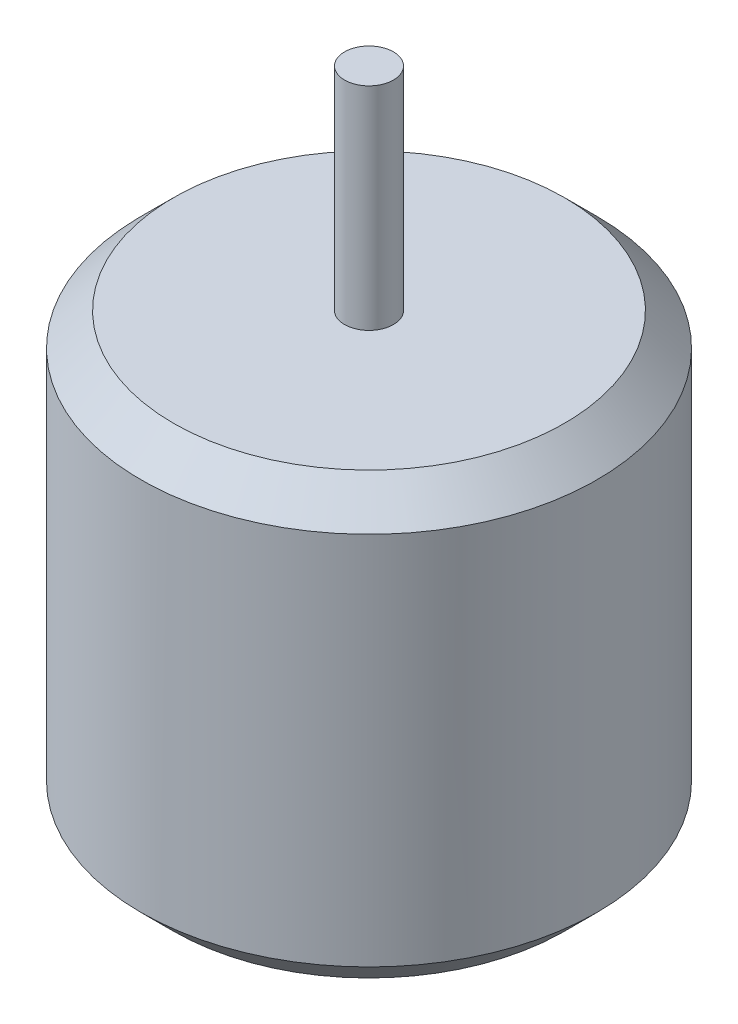
ISO-10303-21;
HEADER;
FILE_DESCRIPTION(('STEP AP214'),'2;1');
FILE_NAME('part.step','',(''),(''),'','','');
FILE_SCHEMA(('AUTOMOTIVE_DESIGN { 1 0 10303 214 1 1 1 1 }'));
ENDSEC;
DATA;
#1=APPLICATION_CONTEXT('core data for automotive mechanical design processes');
#2=APPLICATION_PROTOCOL_DEFINITION('international standard','automotive_design',2000,#1);
#3=PRODUCT_CONTEXT('',#1,'mechanical');
#4=PRODUCT('Part','Part','',(#3));
#5=PRODUCT_RELATED_PRODUCT_CATEGORY('part','',(#4));
#6=PRODUCT_DEFINITION_FORMATION('','',#4);
#7=PRODUCT_DEFINITION_CONTEXT('part definition',#1,'design');
#8=PRODUCT_DEFINITION('design','',#6,#7);
#9=PRODUCT_DEFINITION_SHAPE('','',#8);
#10=(LENGTH_UNIT() NAMED_UNIT(*) SI_UNIT(.MILLI.,.METRE.));
#11=(NAMED_UNIT(*) PLANE_ANGLE_UNIT() SI_UNIT($,.RADIAN.));
#12=(NAMED_UNIT(*) SI_UNIT($,.STERADIAN.) SOLID_ANGLE_UNIT());
#13=UNCERTAINTY_MEASURE_WITH_UNIT(LENGTH_MEASURE(1.E-05),#10,'distance_accuracy_value','');
#14=(GEOMETRIC_REPRESENTATION_CONTEXT(3) GLOBAL_UNCERTAINTY_ASSIGNED_CONTEXT((#13)) GLOBAL_UNIT_ASSIGNED_CONTEXT((#10,
#11,#12)) REPRESENTATION_CONTEXT('',''));
#15=CARTESIAN_POINT('',(0.,0.,0.));
#16=DIRECTION('',(0.,0.,1.));
#17=DIRECTION('',(1.,0.,0.));
#18=AXIS2_PLACEMENT_3D('',#15,#16,#17);
#19=CARTESIAN_POINT('',(0.,27.,0.));
#20=DIRECTION('',(0.,1.,0.));
#21=DIRECTION('',(0.,0.,1.));
#22=AXIS2_PLACEMENT_3D('',#19,#20,#21);
#23=PLANE('',#22);
#24=CARTESIAN_POINT('',(0.,27.,0.));
#25=DIRECTION('',(0.,1.,0.));
#26=DIRECTION('',(0.,0.,1.));
#27=AXIS2_PLACEMENT_3D('',#24,#25,#26);
#28=CIRCLE('',#27,12.);
#29=CARTESIAN_POINT('',(0.,27.,12.));
#30=VERTEX_POINT('',#29);
#31=EDGE_CURVE('E37',#30,#30,#28,.T.);
#32=ORIENTED_EDGE('',*,*,#31,.T.);
#33=EDGE_LOOP('',(#32));
#34=FACE_BOUND('',#33,.T.);
#35=CARTESIAN_POINT('',(0.,27.,0.));
#36=DIRECTION('',(0.,1.,0.));
#37=DIRECTION('',(0.,0.,1.));
#38=AXIS2_PLACEMENT_3D('',#35,#36,#37);
#39=CIRCLE('',#38,1.5);
#40=CARTESIAN_POINT('',(0.,27.,-1.5));
#41=VERTEX_POINT('',#40);
#42=EDGE_CURVE('E81',#41,#41,#39,.T.);
#43=ORIENTED_EDGE('',*,*,#42,.F.);
#44=EDGE_LOOP('',(#43));
#45=FACE_BOUND('',#44,.T.);
#46=ADVANCED_FACE('F30',(#34,#45),#23,.T.);
#47=CARTESIAN_POINT('',(0.,0.,0.));
#48=DIRECTION('',(0.,1.,0.));
#49=DIRECTION('',(0.,0.,1.));
#50=AXIS2_PLACEMENT_3D('',#47,#48,#49);
#51=PLANE('',#50);
#52=CARTESIAN_POINT('',(0.,0.,0.));
#53=DIRECTION('',(0.,1.,0.));
#54=DIRECTION('',(0.,0.,1.));
#55=AXIS2_PLACEMENT_3D('',#52,#53,#54);
#56=CIRCLE('',#55,12.);
#57=CARTESIAN_POINT('',(0.,0.,12.));
#58=VERTEX_POINT('',#57);
#59=EDGE_CURVE('E41',#58,#58,#56,.F.);
#60=ORIENTED_EDGE('',*,*,#59,.T.);
#61=EDGE_LOOP('',(#60));
#62=FACE_BOUND('',#61,.T.);
#63=CARTESIAN_POINT('',(6.71751442127216,0.,6.71751442127224));
#64=DIRECTION('',(0.,1.,0.));
#65=DIRECTION('',(0.,0.,-1.));
#66=AXIS2_PLACEMENT_3D('',#63,#64,#65);
#67=CIRCLE('',#66,1.6);
#68=CARTESIAN_POINT('',(6.71751442127216,0.,5.11751442127224));
#69=VERTEX_POINT('',#68);
#70=EDGE_CURVE('E59',#69,#69,#67,.T.);
#71=ORIENTED_EDGE('',*,*,#70,.T.);
#72=EDGE_LOOP('',(#71));
#73=FACE_BOUND('',#72,.T.);
#74=CARTESIAN_POINT('',(5.65685424949239,0.,-5.65685424949237));
#75=DIRECTION('',(0.,1.,0.));
#76=DIRECTION('',(0.,0.,1.));
#77=AXIS2_PLACEMENT_3D('',#74,#75,#76);
#78=CIRCLE('',#77,1.6);
#79=CARTESIAN_POINT('',(5.65685424949239,0.,-7.25685424949237));
#80=VERTEX_POINT('',#79);
#81=EDGE_CURVE('E53',#80,#80,#78,.T.);
#82=ORIENTED_EDGE('',*,*,#81,.T.);
#83=EDGE_LOOP('',(#82));
#84=FACE_BOUND('',#83,.T.);
#85=CARTESIAN_POINT('',(-6.71751442127221,0.,-6.71751442127219));
#86=DIRECTION('',(0.,1.,0.));
#87=DIRECTION('',(0.,0.,1.));
#88=AXIS2_PLACEMENT_3D('',#85,#86,#87);
#89=CIRCLE('',#88,1.6);
#90=CARTESIAN_POINT('',(-6.71751442127221,0.,-8.31751442127219));
#91=VERTEX_POINT('',#90);
#92=EDGE_CURVE('E50',#91,#91,#89,.T.);
#93=ORIENTED_EDGE('',*,*,#92,.T.);
#94=EDGE_LOOP('',(#93));
#95=FACE_BOUND('',#94,.T.);
#96=CARTESIAN_POINT('',(0.,0.,0.));
#97=DIRECTION('',(0.,1.,0.));
#98=DIRECTION('',(0.,0.,1.));
#99=AXIS2_PLACEMENT_3D('',#96,#97,#98);
#100=CIRCLE('',#99,4.25);
#101=CARTESIAN_POINT('',(0.,0.,-4.25));
#102=VERTEX_POINT('',#101);
#103=EDGE_CURVE('E56',#102,#102,#100,.T.);
#104=ORIENTED_EDGE('',*,*,#103,.T.);
#105=EDGE_LOOP('',(#104));
#106=FACE_BOUND('',#105,.T.);
#107=CARTESIAN_POINT('',(-5.65685424949235,0.,5.65685424949241));
#108=DIRECTION('',(0.,1.,0.));
#109=DIRECTION('',(0.,0.,-1.));
#110=AXIS2_PLACEMENT_3D('',#107,#108,#109);
#111=CIRCLE('',#110,1.6);
#112=CARTESIAN_POINT('',(-5.65685424949235,0.,4.05685424949241));
#113=VERTEX_POINT('',#112);
#114=EDGE_CURVE('E62',#113,#113,#111,.T.);
#115=ORIENTED_EDGE('',*,*,#114,.T.);
#116=EDGE_LOOP('',(#115));
#117=FACE_BOUND('',#116,.T.);
#118=ADVANCED_FACE('F96',(#62,#73,#84,#95,#106,#117),#51,.F.);
#119=CARTESIAN_POINT('',(0.,26.,0.));
#120=DIRECTION('',(0.,-1.,0.));
#121=DIRECTION('',(0.,0.,-1.));
#122=AXIS2_PLACEMENT_3D('',#119,#120,#121);
#123=CYLINDRICAL_SURFACE('',#122,14.);
#124=CARTESIAN_POINT('',(0.,25.,0.));
#125=DIRECTION('',(0.,1.,0.));
#126=DIRECTION('',(0.,0.,1.));
#127=AXIS2_PLACEMENT_3D('',#124,#125,#126);
#128=CIRCLE('',#127,14.);
#129=CARTESIAN_POINT('',(0.,25.,-14.));
#130=VERTEX_POINT('',#129);
#131=EDGE_CURVE('E10',#130,#130,#128,.F.);
#132=CARTESIAN_POINT('',(0.,2.00000000000002,0.));
#133=DIRECTION('',(0.,1.,0.));
#134=DIRECTION('',(0.,0.,1.));
#135=AXIS2_PLACEMENT_3D('',#132,#133,#134);
#136=CIRCLE('',#135,14.);
#137=CARTESIAN_POINT('',(0.,2.00000000000002,-14.));
#138=VERTEX_POINT('',#137);
#139=EDGE_CURVE('E45',#138,#138,#136,.T.);
#140=CARTESIAN_POINT('',(0.,25.,-14.));
#141=CARTESIAN_POINT('',(0.,24.7604166666667,-14.));
#142=CARTESIAN_POINT('',(0.,24.5208333333334,-14.));
#143=CARTESIAN_POINT('',(0.,24.0416666666667,-14.));
#144=CARTESIAN_POINT('',(0.,23.8020833333334,-14.));
#145=CARTESIAN_POINT('',(0.,23.3229166666667,-14.));
#146=CARTESIAN_POINT('',(0.,23.0833333333334,-14.));
#147=CARTESIAN_POINT('',(0.,22.6041666666667,-14.));
#148=CARTESIAN_POINT('',(0.,22.3645833333334,-14.));
#149=CARTESIAN_POINT('',(0.,21.8854166666667,-14.));
#150=CARTESIAN_POINT('',(0.,21.6458333333334,-14.));
#151=CARTESIAN_POINT('',(0.,21.1666666666667,-14.));
#152=CARTESIAN_POINT('',(0.,20.9270833333334,-14.));
#153=CARTESIAN_POINT('',(0.,20.4479166666667,-14.));
#154=CARTESIAN_POINT('',(0.,20.2083333333334,-14.));
#155=CARTESIAN_POINT('',(0.,19.7291666666667,-14.));
#156=CARTESIAN_POINT('',(0.,19.4895833333334,-14.));
#157=CARTESIAN_POINT('',(0.,19.0104166666667,-14.));
#158=CARTESIAN_POINT('',(0.,18.7708333333334,-14.));
#159=CARTESIAN_POINT('',(0.,18.2916666666667,-14.));
#160=CARTESIAN_POINT('',(0.,18.0520833333334,-14.));
#161=CARTESIAN_POINT('',(0.,17.5729166666667,-14.));
#162=CARTESIAN_POINT('',(0.,17.3333333333334,-14.));
#163=CARTESIAN_POINT('',(0.,16.8541666666667,-14.));
#164=CARTESIAN_POINT('',(0.,16.6145833333334,-14.));
#165=CARTESIAN_POINT('',(0.,16.1354166666667,-14.));
#166=CARTESIAN_POINT('',(0.,15.8958333333334,-14.));
#167=CARTESIAN_POINT('',(0.,15.4166666666667,-14.));
#168=CARTESIAN_POINT('',(0.,15.1770833333334,-14.));
#169=CARTESIAN_POINT('',(0.,14.6979166666667,-14.));
#170=CARTESIAN_POINT('',(0.,14.4583333333334,-14.));
#171=CARTESIAN_POINT('',(0.,13.9791666666667,-14.));
#172=CARTESIAN_POINT('',(0.,13.7395833333334,-14.));
#173=CARTESIAN_POINT('',(0.,13.2604166666667,-14.));
#174=CARTESIAN_POINT('',(0.,13.0208333333334,-14.));
#175=CARTESIAN_POINT('',(0.,12.5416666666667,-14.));
#176=CARTESIAN_POINT('',(0.,12.3020833333333,-14.));
#177=CARTESIAN_POINT('',(0.,11.8229166666667,-14.));
#178=CARTESIAN_POINT('',(0.,11.5833333333333,-14.));
#179=CARTESIAN_POINT('',(0.,11.1041666666667,-14.));
#180=CARTESIAN_POINT('',(0.,10.8645833333333,-14.));
#181=CARTESIAN_POINT('',(0.,10.3854166666667,-14.));
#182=CARTESIAN_POINT('',(0.,10.1458333333334,-14.));
#183=CARTESIAN_POINT('',(0.,9.66666666666668,-14.));
#184=CARTESIAN_POINT('',(0.,9.42708333333335,-14.));
#185=CARTESIAN_POINT('',(0.,8.94791666666668,-14.));
#186=CARTESIAN_POINT('',(0.,8.70833333333335,-14.));
#187=CARTESIAN_POINT('',(0.,8.22916666666669,-14.));
#188=CARTESIAN_POINT('',(0.,7.98958333333335,-14.));
#189=CARTESIAN_POINT('',(0.,7.51041666666669,-14.));
#190=CARTESIAN_POINT('',(0.,7.27083333333335,-14.));
#191=CARTESIAN_POINT('',(0.,6.79166666666668,-14.));
#192=CARTESIAN_POINT('',(0.,6.55208333333335,-14.));
#193=CARTESIAN_POINT('',(0.,6.07291666666668,-14.));
#194=CARTESIAN_POINT('',(0.,5.83333333333335,-14.));
#195=CARTESIAN_POINT('',(0.,5.35416666666668,-14.));
#196=CARTESIAN_POINT('',(0.,5.11458333333335,-14.));
#197=CARTESIAN_POINT('',(0.,4.63541666666668,-14.));
#198=CARTESIAN_POINT('',(0.,4.39583333333335,-14.));
#199=CARTESIAN_POINT('',(0.,3.91666666666668,-14.));
#200=CARTESIAN_POINT('',(0.,3.67708333333335,-14.));
#201=CARTESIAN_POINT('',(0.,3.19791666666668,-14.));
#202=CARTESIAN_POINT('',(0.,2.95833333333335,-14.));
#203=CARTESIAN_POINT('',(0.,2.47916666666668,-14.));
#204=CARTESIAN_POINT('',(0.,2.23958333333335,-14.));
#205=CARTESIAN_POINT('',(0.,2.00000000000002,-14.));
#206=B_SPLINE_CURVE_WITH_KNOTS('',3,(#140,#141,#142,#143,#144,#145,#146,#147,#148,#149,#150,
#151,#152,#153,#154,#155,#156,#157,#158,#159,#160,#161,#162,#163,#164,#165,#166,#167,#168,#169,
#170,#171,#172,#173,#174,#175,#176,#177,#178,#179,#180,#181,#182,#183,#184,#185,#186,#187,#188,
#189,#190,#191,#192,#193,#194,#195,#196,#197,#198,#199,#200,#201,#202,#203,#204,#205),
.UNSPECIFIED.,.F.,.F.,(4,2,2,2,2,2,2,2,2,2,2,2,2,2,2,2,2,2,2,2,2,2,2,2,2,2,2,2,2,2,2,2,4),(0.,
0.718750000000001,1.4375,2.15625,2.875,3.59375,4.3125,5.03125,5.75000000000001,6.46875000000001,
7.1875,7.90625000000001,8.625,9.34375000000001,10.0625,10.78125,11.5,12.21875,12.9375,13.65625,
14.375,15.09375,15.8125,16.53125,17.25,17.96875,18.6875,19.40625,20.125,20.84375,21.5625,
22.28125,23.),.UNSPECIFIED.);
#207=EDGE_CURVE('BSEAM101',#130,#138,#206,.T.);
#208=ORIENTED_EDGE('',*,*,#131,.T.);
#209=ORIENTED_EDGE('',*,*,#139,.T.);
#210=ORIENTED_EDGE('',*,*,#207,.T.);
#211=ORIENTED_EDGE('',*,*,#207,.F.);
#212=EDGE_LOOP('',(#208,#210,#209,#211));
#213=FACE_BOUND('',#212,.T.);
#214=ADVANCED_FACE('F101',(#213),#123,.T.);
#215=CARTESIAN_POINT('',(-6.71751442127221,26.,-6.71751442127219));
#216=DIRECTION('',(0.,-1.,0.));
#217=DIRECTION('',(0.,0.,-1.));
#218=AXIS2_PLACEMENT_3D('',#215,#216,#217);
#219=CYLINDRICAL_SURFACE('',#218,1.6);
#220=CARTESIAN_POINT('',(-6.71751442127221,26.,-6.71751442127219));
#221=DIRECTION('',(0.,1.,0.));
#222=DIRECTION('',(0.,0.,1.));
#223=AXIS2_PLACEMENT_3D('',#220,#221,#222);
#224=CIRCLE('',#223,1.6);
#225=CARTESIAN_POINT('',(-6.71751442127221,26.,-8.31751442127219));
#226=VERTEX_POINT('',#225);
#227=EDGE_CURVE('E65',#226,#226,#224,.T.);
#228=CARTESIAN_POINT('',(-6.71751442127221,26.,-8.31751442127219));
#229=CARTESIAN_POINT('',(-6.71751442127221,25.7291666666667,-8.31751442127219));
#230=CARTESIAN_POINT('',(-6.71751442127221,25.4583333333333,-8.31751442127219));
#231=CARTESIAN_POINT('',(-6.71751442127221,24.9166666666667,-8.31751442127219));
#232=CARTESIAN_POINT('',(-6.71751442127221,24.6458333333333,-8.31751442127219));
#233=CARTESIAN_POINT('',(-6.71751442127221,24.1041666666667,-8.31751442127219));
#234=CARTESIAN_POINT('',(-6.71751442127221,23.8333333333333,-8.31751442127219));
#235=CARTESIAN_POINT('',(-6.71751442127221,23.2916666666667,-8.31751442127219));
#236=CARTESIAN_POINT('',(-6.71751442127221,23.0208333333333,-8.31751442127219));
#237=CARTESIAN_POINT('',(-6.71751442127221,22.4791666666667,-8.31751442127219));
#238=CARTESIAN_POINT('',(-6.71751442127221,22.2083333333333,-8.31751442127219));
#239=CARTESIAN_POINT('',(-6.71751442127221,21.6666666666667,-8.31751442127219));
#240=CARTESIAN_POINT('',(-6.71751442127221,21.3958333333333,-8.31751442127219));
#241=CARTESIAN_POINT('',(-6.71751442127221,20.8541666666667,-8.31751442127219));
#242=CARTESIAN_POINT('',(-6.71751442127221,20.5833333333333,-8.31751442127219));
#243=CARTESIAN_POINT('',(-6.71751442127221,20.0416666666667,-8.31751442127219));
#244=CARTESIAN_POINT('',(-6.71751442127221,19.7708333333333,-8.31751442127219));
#245=CARTESIAN_POINT('',(-6.71751442127221,19.2291666666667,-8.31751442127219));
#246=CARTESIAN_POINT('',(-6.71751442127221,18.9583333333333,-8.31751442127219));
#247=CARTESIAN_POINT('',(-6.71751442127221,18.4166666666667,-8.31751442127219));
#248=CARTESIAN_POINT('',(-6.71751442127221,18.1458333333333,-8.31751442127219));
#249=CARTESIAN_POINT('',(-6.71751442127221,17.6041666666667,-8.31751442127219));
#250=CARTESIAN_POINT('',(-6.71751442127221,17.3333333333333,-8.31751442127219));
#251=CARTESIAN_POINT('',(-6.71751442127221,16.7916666666667,-8.31751442127219));
#252=CARTESIAN_POINT('',(-6.71751442127221,16.5208333333333,-8.31751442127219));
#253=CARTESIAN_POINT('',(-6.71751442127221,15.9791666666667,-8.31751442127219));
#254=CARTESIAN_POINT('',(-6.71751442127221,15.7083333333333,-8.31751442127219));
#255=CARTESIAN_POINT('',(-6.71751442127221,15.1666666666667,-8.31751442127219));
#256=CARTESIAN_POINT('',(-6.71751442127221,14.8958333333333,-8.31751442127219));
#257=CARTESIAN_POINT('',(-6.71751442127221,14.3541666666667,-8.31751442127219));
#258=CARTESIAN_POINT('',(-6.71751442127221,14.0833333333333,-8.31751442127219));
#259=CARTESIAN_POINT('',(-6.71751442127221,13.5416666666667,-8.31751442127219));
#260=CARTESIAN_POINT('',(-6.71751442127221,13.2708333333333,-8.31751442127219));
#261=CARTESIAN_POINT('',(-6.71751442127221,12.7291666666667,-8.31751442127219));
#262=CARTESIAN_POINT('',(-6.71751442127221,12.4583333333333,-8.31751442127219));
#263=CARTESIAN_POINT('',(-6.71751442127221,11.9166666666667,-8.31751442127219));
#264=CARTESIAN_POINT('',(-6.71751442127221,11.6458333333333,-8.31751442127219));
#265=CARTESIAN_POINT('',(-6.71751442127221,11.1041666666667,-8.31751442127219));
#266=CARTESIAN_POINT('',(-6.71751442127221,10.8333333333333,-8.31751442127219));
#267=CARTESIAN_POINT('',(-6.71751442127221,10.2916666666667,-8.31751442127219));
#268=CARTESIAN_POINT('',(-6.71751442127221,10.0208333333333,-8.31751442127219));
#269=CARTESIAN_POINT('',(-6.71751442127221,9.47916666666667,-8.31751442127219));
#270=CARTESIAN_POINT('',(-6.71751442127221,9.20833333333333,-8.31751442127219));
#271=CARTESIAN_POINT('',(-6.71751442127221,8.66666666666667,-8.31751442127219));
#272=CARTESIAN_POINT('',(-6.71751442127221,8.39583333333333,-8.31751442127219));
#273=CARTESIAN_POINT('',(-6.71751442127221,7.85416666666667,-8.31751442127219));
#274=CARTESIAN_POINT('',(-6.71751442127221,7.58333333333333,-8.31751442127219));
#275=CARTESIAN_POINT('',(-6.71751442127221,7.04166666666667,-8.31751442127219));
#276=CARTESIAN_POINT('',(-6.71751442127221,6.77083333333333,-8.31751442127219));
#277=CARTESIAN_POINT('',(-6.71751442127221,6.22916666666667,-8.31751442127219));
#278=CARTESIAN_POINT('',(-6.71751442127221,5.95833333333333,-8.31751442127219));
#279=CARTESIAN_POINT('',(-6.71751442127221,5.41666666666667,-8.31751442127219));
#280=CARTESIAN_POINT('',(-6.71751442127221,5.14583333333333,-8.31751442127219));
#281=CARTESIAN_POINT('',(-6.71751442127221,4.60416666666667,-8.31751442127219));
#282=CARTESIAN_POINT('',(-6.71751442127221,4.33333333333333,-8.31751442127219));
#283=CARTESIAN_POINT('',(-6.71751442127221,3.79166666666667,-8.31751442127219));
#284=CARTESIAN_POINT('',(-6.71751442127221,3.52083333333333,-8.31751442127219));
#285=CARTESIAN_POINT('',(-6.71751442127221,2.97916666666667,-8.31751442127219));
#286=CARTESIAN_POINT('',(-6.71751442127221,2.70833333333333,-8.31751442127219));
#287=CARTESIAN_POINT('',(-6.71751442127221,2.16666666666667,-8.31751442127219));
#288=CARTESIAN_POINT('',(-6.71751442127221,1.89583333333333,-8.31751442127219));
#289=CARTESIAN_POINT('',(-6.71751442127221,1.35416666666667,-8.31751442127219));
#290=CARTESIAN_POINT('',(-6.71751442127221,1.08333333333333,-8.31751442127219));
#291=CARTESIAN_POINT('',(-6.71751442127221,0.541666666666667,-8.31751442127219));
#292=CARTESIAN_POINT('',(-6.71751442127221,0.270833333333334,-8.31751442127219));
#293=CARTESIAN_POINT('',(-6.71751442127221,0.,-8.31751442127219));
#294=B_SPLINE_CURVE_WITH_KNOTS('',3,(#228,#229,#230,#231,#232,#233,#234,#235,#236,#237,#238,
#239,#240,#241,#242,#243,#244,#245,#246,#247,#248,#249,#250,#251,#252,#253,#254,#255,#256,#257,
#258,#259,#260,#261,#262,#263,#264,#265,#266,#267,#268,#269,#270,#271,#272,#273,#274,#275,#276,
#277,#278,#279,#280,#281,#282,#283,#284,#285,#286,#287,#288,#289,#290,#291,#292,#293),
.UNSPECIFIED.,.F.,.F.,(4,2,2,2,2,2,2,2,2,2,2,2,2,2,2,2,2,2,2,2,2,2,2,2,2,2,2,2,2,2,2,2,4),(0.,
0.812500000000001,1.625,2.4375,3.25,4.0625,4.875,5.6875,6.5,7.3125,8.125,8.9375,9.75,10.5625,
11.375,12.1875,13.,13.8125,14.625,15.4375,16.25,17.0625,17.875,18.6875,19.5,20.3125,21.125,
21.9375,22.75,23.5625,24.375,25.1875,26.),.UNSPECIFIED.);
#295=EDGE_CURVE('BSEAM128',#226,#91,#294,.T.);
#296=ORIENTED_EDGE('',*,*,#227,.T.);
#297=ORIENTED_EDGE('',*,*,#92,.F.);
#298=ORIENTED_EDGE('',*,*,#295,.T.);
#299=ORIENTED_EDGE('',*,*,#295,.F.);
#300=EDGE_LOOP('',(#296,#298,#297,#299));
#301=FACE_BOUND('',#300,.T.);
#302=ADVANCED_FACE('F128',(#301),#219,.F.);
#303=CARTESIAN_POINT('',(5.65685424949239,26.,-5.65685424949237));
#304=DIRECTION('',(0.,-1.,0.));
#305=DIRECTION('',(0.,0.,-1.));
#306=AXIS2_PLACEMENT_3D('',#303,#304,#305);
#307=CYLINDRICAL_SURFACE('',#306,1.6);
#308=CARTESIAN_POINT('',(5.65685424949239,26.,-5.65685424949237));
#309=DIRECTION('',(0.,1.,0.));
#310=DIRECTION('',(0.,0.,1.));
#311=AXIS2_PLACEMENT_3D('',#308,#309,#310);
#312=CIRCLE('',#311,1.6);
#313=CARTESIAN_POINT('',(5.65685424949239,26.,-7.25685424949237));
#314=VERTEX_POINT('',#313);
#315=EDGE_CURVE('E68',#314,#314,#312,.T.);
#316=CARTESIAN_POINT('',(5.65685424949239,26.,-7.25685424949237));
#317=CARTESIAN_POINT('',(5.65685424949239,25.7291666666667,-7.25685424949237));
#318=CARTESIAN_POINT('',(5.65685424949239,25.4583333333333,-7.25685424949237));
#319=CARTESIAN_POINT('',(5.65685424949239,24.9166666666667,-7.25685424949237));
#320=CARTESIAN_POINT('',(5.65685424949239,24.6458333333333,-7.25685424949237));
#321=CARTESIAN_POINT('',(5.65685424949239,24.1041666666667,-7.25685424949237));
#322=CARTESIAN_POINT('',(5.65685424949239,23.8333333333333,-7.25685424949237));
#323=CARTESIAN_POINT('',(5.65685424949239,23.2916666666667,-7.25685424949237));
#324=CARTESIAN_POINT('',(5.65685424949239,23.0208333333333,-7.25685424949237));
#325=CARTESIAN_POINT('',(5.65685424949239,22.4791666666667,-7.25685424949237));
#326=CARTESIAN_POINT('',(5.65685424949239,22.2083333333333,-7.25685424949237));
#327=CARTESIAN_POINT('',(5.65685424949239,21.6666666666667,-7.25685424949237));
#328=CARTESIAN_POINT('',(5.65685424949239,21.3958333333333,-7.25685424949237));
#329=CARTESIAN_POINT('',(5.65685424949239,20.8541666666667,-7.25685424949237));
#330=CARTESIAN_POINT('',(5.65685424949239,20.5833333333333,-7.25685424949237));
#331=CARTESIAN_POINT('',(5.65685424949239,20.0416666666667,-7.25685424949237));
#332=CARTESIAN_POINT('',(5.65685424949239,19.7708333333333,-7.25685424949237));
#333=CARTESIAN_POINT('',(5.65685424949239,19.2291666666667,-7.25685424949237));
#334=CARTESIAN_POINT('',(5.65685424949239,18.9583333333333,-7.25685424949237));
#335=CARTESIAN_POINT('',(5.65685424949239,18.4166666666667,-7.25685424949237));
#336=CARTESIAN_POINT('',(5.65685424949239,18.1458333333333,-7.25685424949237));
#337=CARTESIAN_POINT('',(5.65685424949239,17.6041666666667,-7.25685424949237));
#338=CARTESIAN_POINT('',(5.65685424949239,17.3333333333333,-7.25685424949237));
#339=CARTESIAN_POINT('',(5.65685424949239,16.7916666666667,-7.25685424949237));
#340=CARTESIAN_POINT('',(5.65685424949239,16.5208333333333,-7.25685424949237));
#341=CARTESIAN_POINT('',(5.65685424949239,15.9791666666667,-7.25685424949237));
#342=CARTESIAN_POINT('',(5.65685424949239,15.7083333333333,-7.25685424949237));
#343=CARTESIAN_POINT('',(5.65685424949239,15.1666666666667,-7.25685424949237));
#344=CARTESIAN_POINT('',(5.65685424949239,14.8958333333333,-7.25685424949237));
#345=CARTESIAN_POINT('',(5.65685424949239,14.3541666666667,-7.25685424949237));
#346=CARTESIAN_POINT('',(5.65685424949239,14.0833333333333,-7.25685424949237));
#347=CARTESIAN_POINT('',(5.65685424949239,13.5416666666667,-7.25685424949237));
#348=CARTESIAN_POINT('',(5.65685424949239,13.2708333333333,-7.25685424949237));
#349=CARTESIAN_POINT('',(5.65685424949239,12.7291666666667,-7.25685424949237));
#350=CARTESIAN_POINT('',(5.65685424949239,12.4583333333333,-7.25685424949237));
#351=CARTESIAN_POINT('',(5.65685424949239,11.9166666666667,-7.25685424949237));
#352=CARTESIAN_POINT('',(5.65685424949239,11.6458333333333,-7.25685424949237));
#353=CARTESIAN_POINT('',(5.65685424949239,11.1041666666667,-7.25685424949237));
#354=CARTESIAN_POINT('',(5.65685424949239,10.8333333333333,-7.25685424949237));
#355=CARTESIAN_POINT('',(5.65685424949239,10.2916666666667,-7.25685424949237));
#356=CARTESIAN_POINT('',(5.65685424949239,10.0208333333333,-7.25685424949237));
#357=CARTESIAN_POINT('',(5.65685424949239,9.47916666666667,-7.25685424949237));
#358=CARTESIAN_POINT('',(5.65685424949239,9.20833333333333,-7.25685424949237));
#359=CARTESIAN_POINT('',(5.65685424949239,8.66666666666667,-7.25685424949237));
#360=CARTESIAN_POINT('',(5.65685424949239,8.39583333333333,-7.25685424949237));
#361=CARTESIAN_POINT('',(5.65685424949239,7.85416666666667,-7.25685424949237));
#362=CARTESIAN_POINT('',(5.65685424949239,7.58333333333333,-7.25685424949237));
#363=CARTESIAN_POINT('',(5.65685424949239,7.04166666666667,-7.25685424949237));
#364=CARTESIAN_POINT('',(5.65685424949239,6.77083333333333,-7.25685424949237));
#365=CARTESIAN_POINT('',(5.65685424949239,6.22916666666667,-7.25685424949237));
#366=CARTESIAN_POINT('',(5.65685424949239,5.95833333333333,-7.25685424949237));
#367=CARTESIAN_POINT('',(5.65685424949239,5.41666666666667,-7.25685424949237));
#368=CARTESIAN_POINT('',(5.65685424949239,5.14583333333333,-7.25685424949237));
#369=CARTESIAN_POINT('',(5.65685424949239,4.60416666666667,-7.25685424949237));
#370=CARTESIAN_POINT('',(5.65685424949239,4.33333333333333,-7.25685424949237));
#371=CARTESIAN_POINT('',(5.65685424949239,3.79166666666667,-7.25685424949237));
#372=CARTESIAN_POINT('',(5.65685424949239,3.52083333333333,-7.25685424949237));
#373=CARTESIAN_POINT('',(5.65685424949239,2.97916666666667,-7.25685424949237));
#374=CARTESIAN_POINT('',(5.65685424949239,2.70833333333333,-7.25685424949237));
#375=CARTESIAN_POINT('',(5.65685424949239,2.16666666666667,-7.25685424949237));
#376=CARTESIAN_POINT('',(5.65685424949239,1.89583333333333,-7.25685424949237));
#377=CARTESIAN_POINT('',(5.65685424949239,1.35416666666667,-7.25685424949237));
#378=CARTESIAN_POINT('',(5.65685424949239,1.08333333333333,-7.25685424949237));
#379=CARTESIAN_POINT('',(5.65685424949239,0.541666666666667,-7.25685424949237));
#380=CARTESIAN_POINT('',(5.65685424949239,0.270833333333334,-7.25685424949237));
#381=CARTESIAN_POINT('',(5.65685424949239,0.,-7.25685424949237));
#382=B_SPLINE_CURVE_WITH_KNOTS('',3,(#316,#317,#318,#319,#320,#321,#322,#323,#324,#325,#326,
#327,#328,#329,#330,#331,#332,#333,#334,#335,#336,#337,#338,#339,#340,#341,#342,#343,#344,#345,
#346,#347,#348,#349,#350,#351,#352,#353,#354,#355,#356,#357,#358,#359,#360,#361,#362,#363,#364,
#365,#366,#367,#368,#369,#370,#371,#372,#373,#374,#375,#376,#377,#378,#379,#380,#381),
.UNSPECIFIED.,.F.,.F.,(4,2,2,2,2,2,2,2,2,2,2,2,2,2,2,2,2,2,2,2,2,2,2,2,2,2,2,2,2,2,2,2,4),(0.,
0.812500000000001,1.625,2.4375,3.25,4.0625,4.875,5.6875,6.5,7.3125,8.125,8.9375,9.75,10.5625,
11.375,12.1875,13.,13.8125,14.625,15.4375,16.25,17.0625,17.875,18.6875,19.5,20.3125,21.125,
21.9375,22.75,23.5625,24.375,25.1875,26.),.UNSPECIFIED.);
#383=EDGE_CURVE('BSEAM124',#314,#80,#382,.T.);
#384=ORIENTED_EDGE('',*,*,#315,.T.);
#385=ORIENTED_EDGE('',*,*,#81,.F.);
#386=ORIENTED_EDGE('',*,*,#383,.T.);
#387=ORIENTED_EDGE('',*,*,#383,.F.);
#388=EDGE_LOOP('',(#384,#386,#385,#387));
#389=FACE_BOUND('',#388,.T.);
#390=ADVANCED_FACE('F124',(#389),#307,.F.);
#391=CARTESIAN_POINT('',(0.,26.,0.));
#392=DIRECTION('',(0.,-1.,0.));
#393=DIRECTION('',(0.,0.,-1.));
#394=AXIS2_PLACEMENT_3D('',#391,#392,#393);
#395=CYLINDRICAL_SURFACE('',#394,4.25);
#396=CARTESIAN_POINT('',(0.,26.,0.));
#397=DIRECTION('',(0.,1.,0.));
#398=DIRECTION('',(0.,0.,1.));
#399=AXIS2_PLACEMENT_3D('',#396,#397,#398);
#400=CIRCLE('',#399,4.25);
#401=CARTESIAN_POINT('',(0.,26.,-4.25));
#402=VERTEX_POINT('',#401);
#403=EDGE_CURVE('E71',#402,#402,#400,.T.);
#404=CARTESIAN_POINT('',(0.,26.,-4.25));
#405=CARTESIAN_POINT('',(0.,25.7291666666667,-4.25));
#406=CARTESIAN_POINT('',(0.,25.4583333333333,-4.25));
#407=CARTESIAN_POINT('',(0.,24.9166666666667,-4.25));
#408=CARTESIAN_POINT('',(0.,24.6458333333333,-4.25));
#409=CARTESIAN_POINT('',(0.,24.1041666666667,-4.25));
#410=CARTESIAN_POINT('',(0.,23.8333333333333,-4.25));
#411=CARTESIAN_POINT('',(0.,23.2916666666667,-4.25));
#412=CARTESIAN_POINT('',(0.,23.0208333333333,-4.25));
#413=CARTESIAN_POINT('',(0.,22.4791666666667,-4.25));
#414=CARTESIAN_POINT('',(0.,22.2083333333333,-4.25));
#415=CARTESIAN_POINT('',(0.,21.6666666666667,-4.25));
#416=CARTESIAN_POINT('',(0.,21.3958333333333,-4.25));
#417=CARTESIAN_POINT('',(0.,20.8541666666667,-4.25));
#418=CARTESIAN_POINT('',(0.,20.5833333333333,-4.25));
#419=CARTESIAN_POINT('',(0.,20.0416666666667,-4.25));
#420=CARTESIAN_POINT('',(0.,19.7708333333333,-4.25));
#421=CARTESIAN_POINT('',(0.,19.2291666666667,-4.25));
#422=CARTESIAN_POINT('',(0.,18.9583333333333,-4.25));
#423=CARTESIAN_POINT('',(0.,18.4166666666667,-4.25));
#424=CARTESIAN_POINT('',(0.,18.1458333333333,-4.25));
#425=CARTESIAN_POINT('',(0.,17.6041666666667,-4.25));
#426=CARTESIAN_POINT('',(0.,17.3333333333333,-4.25));
#427=CARTESIAN_POINT('',(0.,16.7916666666667,-4.25));
#428=CARTESIAN_POINT('',(0.,16.5208333333333,-4.25));
#429=CARTESIAN_POINT('',(0.,15.9791666666667,-4.25));
#430=CARTESIAN_POINT('',(0.,15.7083333333333,-4.25));
#431=CARTESIAN_POINT('',(0.,15.1666666666667,-4.25));
#432=CARTESIAN_POINT('',(0.,14.8958333333333,-4.25));
#433=CARTESIAN_POINT('',(0.,14.3541666666667,-4.25));
#434=CARTESIAN_POINT('',(0.,14.0833333333333,-4.25));
#435=CARTESIAN_POINT('',(0.,13.5416666666667,-4.25));
#436=CARTESIAN_POINT('',(0.,13.2708333333333,-4.25));
#437=CARTESIAN_POINT('',(0.,12.7291666666667,-4.25));
#438=CARTESIAN_POINT('',(0.,12.4583333333333,-4.25));
#439=CARTESIAN_POINT('',(0.,11.9166666666667,-4.25));
#440=CARTESIAN_POINT('',(0.,11.6458333333333,-4.25));
#441=CARTESIAN_POINT('',(0.,11.1041666666667,-4.25));
#442=CARTESIAN_POINT('',(0.,10.8333333333333,-4.25));
#443=CARTESIAN_POINT('',(0.,10.2916666666667,-4.25));
#444=CARTESIAN_POINT('',(0.,10.0208333333333,-4.25));
#445=CARTESIAN_POINT('',(0.,9.47916666666667,-4.25));
#446=CARTESIAN_POINT('',(0.,9.20833333333333,-4.25));
#447=CARTESIAN_POINT('',(0.,8.66666666666667,-4.25));
#448=CARTESIAN_POINT('',(0.,8.39583333333333,-4.25));
#449=CARTESIAN_POINT('',(0.,7.85416666666667,-4.25));
#450=CARTESIAN_POINT('',(0.,7.58333333333333,-4.25));
#451=CARTESIAN_POINT('',(0.,7.04166666666667,-4.25));
#452=CARTESIAN_POINT('',(0.,6.77083333333333,-4.25));
#453=CARTESIAN_POINT('',(0.,6.22916666666667,-4.25));
#454=CARTESIAN_POINT('',(0.,5.95833333333333,-4.25));
#455=CARTESIAN_POINT('',(0.,5.41666666666667,-4.25));
#456=CARTESIAN_POINT('',(0.,5.14583333333333,-4.25));
#457=CARTESIAN_POINT('',(0.,4.60416666666667,-4.25));
#458=CARTESIAN_POINT('',(0.,4.33333333333333,-4.25));
#459=CARTESIAN_POINT('',(0.,3.79166666666667,-4.25));
#460=CARTESIAN_POINT('',(0.,3.52083333333333,-4.25));
#461=CARTESIAN_POINT('',(0.,2.97916666666667,-4.25));
#462=CARTESIAN_POINT('',(0.,2.70833333333333,-4.25));
#463=CARTESIAN_POINT('',(0.,2.16666666666667,-4.25));
#464=CARTESIAN_POINT('',(0.,1.89583333333333,-4.25));
#465=CARTESIAN_POINT('',(0.,1.35416666666667,-4.25));
#466=CARTESIAN_POINT('',(0.,1.08333333333333,-4.25));
#467=CARTESIAN_POINT('',(0.,0.541666666666667,-4.25));
#468=CARTESIAN_POINT('',(0.,0.270833333333334,-4.25));
#469=CARTESIAN_POINT('',(0.,0.,-4.25));
#470=B_SPLINE_CURVE_WITH_KNOTS('',3,(#404,#405,#406,#407,#408,#409,#410,#411,#412,#413,#414,
#415,#416,#417,#418,#419,#420,#421,#422,#423,#424,#425,#426,#427,#428,#429,#430,#431,#432,#433,
#434,#435,#436,#437,#438,#439,#440,#441,#442,#443,#444,#445,#446,#447,#448,#449,#450,#451,#452,
#453,#454,#455,#456,#457,#458,#459,#460,#461,#462,#463,#464,#465,#466,#467,#468,#469),
.UNSPECIFIED.,.F.,.F.,(4,2,2,2,2,2,2,2,2,2,2,2,2,2,2,2,2,2,2,2,2,2,2,2,2,2,2,2,2,2,2,2,4),(0.,
0.812499999999997,1.625,2.4375,3.25,4.0625,4.875,5.6875,6.5,7.3125,8.125,8.93749999999999,
9.74999999999999,10.5625,11.375,12.1875,13.,13.8125,14.625,15.4375,16.25,17.0625,17.875,18.6875,
19.5,20.3125,21.125,21.9375,22.75,23.5625,24.375,25.1875,26.),.UNSPECIFIED.);
#471=EDGE_CURVE('BSEAM120',#402,#102,#470,.T.);
#472=ORIENTED_EDGE('',*,*,#403,.T.);
#473=ORIENTED_EDGE('',*,*,#103,.F.);
#474=ORIENTED_EDGE('',*,*,#471,.T.);
#475=ORIENTED_EDGE('',*,*,#471,.F.);
#476=EDGE_LOOP('',(#472,#474,#473,#475));
#477=FACE_BOUND('',#476,.T.);
#478=ADVANCED_FACE('F120',(#477),#395,.F.);
#479=CARTESIAN_POINT('',(6.71751442127216,26.,6.71751442127224));
#480=DIRECTION('',(0.,-1.,0.));
#481=DIRECTION('',(0.,0.,-1.));
#482=AXIS2_PLACEMENT_3D('',#479,#480,#481);
#483=CYLINDRICAL_SURFACE('',#482,1.6);
#484=CARTESIAN_POINT('',(6.71751442127216,26.,6.71751442127224));
#485=DIRECTION('',(0.,1.,0.));
#486=DIRECTION('',(0.,0.,1.));
#487=AXIS2_PLACEMENT_3D('',#484,#485,#486);
#488=CIRCLE('',#487,1.6);
#489=CARTESIAN_POINT('',(6.71751442127216,26.,5.11751442127224));
#490=VERTEX_POINT('',#489);
#491=EDGE_CURVE('E74',#490,#490,#488,.T.);
#492=CARTESIAN_POINT('',(6.71751442127216,26.,5.11751442127224));
#493=CARTESIAN_POINT('',(6.71751442127216,25.7291666666667,5.11751442127224));
#494=CARTESIAN_POINT('',(6.71751442127216,25.4583333333333,5.11751442127224));
#495=CARTESIAN_POINT('',(6.71751442127216,24.9166666666667,5.11751442127224));
#496=CARTESIAN_POINT('',(6.71751442127216,24.6458333333333,5.11751442127224));
#497=CARTESIAN_POINT('',(6.71751442127216,24.1041666666667,5.11751442127224));
#498=CARTESIAN_POINT('',(6.71751442127216,23.8333333333333,5.11751442127224));
#499=CARTESIAN_POINT('',(6.71751442127216,23.2916666666667,5.11751442127224));
#500=CARTESIAN_POINT('',(6.71751442127216,23.0208333333333,5.11751442127224));
#501=CARTESIAN_POINT('',(6.71751442127216,22.4791666666667,5.11751442127224));
#502=CARTESIAN_POINT('',(6.71751442127216,22.2083333333333,5.11751442127224));
#503=CARTESIAN_POINT('',(6.71751442127216,21.6666666666667,5.11751442127224));
#504=CARTESIAN_POINT('',(6.71751442127216,21.3958333333333,5.11751442127224));
#505=CARTESIAN_POINT('',(6.71751442127216,20.8541666666667,5.11751442127224));
#506=CARTESIAN_POINT('',(6.71751442127216,20.5833333333333,5.11751442127224));
#507=CARTESIAN_POINT('',(6.71751442127216,20.0416666666667,5.11751442127224));
#508=CARTESIAN_POINT('',(6.71751442127216,19.7708333333333,5.11751442127224));
#509=CARTESIAN_POINT('',(6.71751442127216,19.2291666666667,5.11751442127224));
#510=CARTESIAN_POINT('',(6.71751442127216,18.9583333333333,5.11751442127224));
#511=CARTESIAN_POINT('',(6.71751442127216,18.4166666666667,5.11751442127224));
#512=CARTESIAN_POINT('',(6.71751442127216,18.1458333333333,5.11751442127224));
#513=CARTESIAN_POINT('',(6.71751442127216,17.6041666666667,5.11751442127224));
#514=CARTESIAN_POINT('',(6.71751442127216,17.3333333333333,5.11751442127224));
#515=CARTESIAN_POINT('',(6.71751442127216,16.7916666666667,5.11751442127224));
#516=CARTESIAN_POINT('',(6.71751442127216,16.5208333333333,5.11751442127224));
#517=CARTESIAN_POINT('',(6.71751442127216,15.9791666666667,5.11751442127224));
#518=CARTESIAN_POINT('',(6.71751442127216,15.7083333333333,5.11751442127224));
#519=CARTESIAN_POINT('',(6.71751442127216,15.1666666666667,5.11751442127224));
#520=CARTESIAN_POINT('',(6.71751442127216,14.8958333333333,5.11751442127224));
#521=CARTESIAN_POINT('',(6.71751442127216,14.3541666666667,5.11751442127224));
#522=CARTESIAN_POINT('',(6.71751442127216,14.0833333333333,5.11751442127224));
#523=CARTESIAN_POINT('',(6.71751442127216,13.5416666666667,5.11751442127224));
#524=CARTESIAN_POINT('',(6.71751442127216,13.2708333333333,5.11751442127224));
#525=CARTESIAN_POINT('',(6.71751442127216,12.7291666666667,5.11751442127224));
#526=CARTESIAN_POINT('',(6.71751442127216,12.4583333333333,5.11751442127224));
#527=CARTESIAN_POINT('',(6.71751442127216,11.9166666666667,5.11751442127224));
#528=CARTESIAN_POINT('',(6.71751442127216,11.6458333333333,5.11751442127224));
#529=CARTESIAN_POINT('',(6.71751442127216,11.1041666666667,5.11751442127224));
#530=CARTESIAN_POINT('',(6.71751442127216,10.8333333333333,5.11751442127224));
#531=CARTESIAN_POINT('',(6.71751442127216,10.2916666666667,5.11751442127224));
#532=CARTESIAN_POINT('',(6.71751442127216,10.0208333333333,5.11751442127224));
#533=CARTESIAN_POINT('',(6.71751442127216,9.47916666666667,5.11751442127224));
#534=CARTESIAN_POINT('',(6.71751442127216,9.20833333333333,5.11751442127224));
#535=CARTESIAN_POINT('',(6.71751442127216,8.66666666666667,5.11751442127224));
#536=CARTESIAN_POINT('',(6.71751442127216,8.39583333333333,5.11751442127224));
#537=CARTESIAN_POINT('',(6.71751442127216,7.85416666666667,5.11751442127224));
#538=CARTESIAN_POINT('',(6.71751442127216,7.58333333333333,5.11751442127224));
#539=CARTESIAN_POINT('',(6.71751442127216,7.04166666666667,5.11751442127224));
#540=CARTESIAN_POINT('',(6.71751442127216,6.77083333333333,5.11751442127224));
#541=CARTESIAN_POINT('',(6.71751442127216,6.22916666666667,5.11751442127224));
#542=CARTESIAN_POINT('',(6.71751442127216,5.95833333333333,5.11751442127224));
#543=CARTESIAN_POINT('',(6.71751442127216,5.41666666666667,5.11751442127224));
#544=CARTESIAN_POINT('',(6.71751442127216,5.14583333333333,5.11751442127224));
#545=CARTESIAN_POINT('',(6.71751442127216,4.60416666666667,5.11751442127224));
#546=CARTESIAN_POINT('',(6.71751442127216,4.33333333333333,5.11751442127224));
#547=CARTESIAN_POINT('',(6.71751442127216,3.79166666666667,5.11751442127224));
#548=CARTESIAN_POINT('',(6.71751442127216,3.52083333333333,5.11751442127224));
#549=CARTESIAN_POINT('',(6.71751442127216,2.97916666666667,5.11751442127224));
#550=CARTESIAN_POINT('',(6.71751442127216,2.70833333333333,5.11751442127224));
#551=CARTESIAN_POINT('',(6.71751442127216,2.16666666666667,5.11751442127224));
#552=CARTESIAN_POINT('',(6.71751442127216,1.89583333333333,5.11751442127224));
#553=CARTESIAN_POINT('',(6.71751442127216,1.35416666666667,5.11751442127224));
#554=CARTESIAN_POINT('',(6.71751442127216,1.08333333333333,5.11751442127224));
#555=CARTESIAN_POINT('',(6.71751442127216,0.541666666666667,5.11751442127224));
#556=CARTESIAN_POINT('',(6.71751442127216,0.270833333333334,5.11751442127224));
#557=CARTESIAN_POINT('',(6.71751442127216,0.,5.11751442127224));
#558=B_SPLINE_CURVE_WITH_KNOTS('',3,(#492,#493,#494,#495,#496,#497,#498,#499,#500,#501,#502,
#503,#504,#505,#506,#507,#508,#509,#510,#511,#512,#513,#514,#515,#516,#517,#518,#519,#520,#521,
#522,#523,#524,#525,#526,#527,#528,#529,#530,#531,#532,#533,#534,#535,#536,#537,#538,#539,#540,
#541,#542,#543,#544,#545,#546,#547,#548,#549,#550,#551,#552,#553,#554,#555,#556,#557),
.UNSPECIFIED.,.F.,.F.,(4,2,2,2,2,2,2,2,2,2,2,2,2,2,2,2,2,2,2,2,2,2,2,2,2,2,2,2,2,2,2,2,4),(0.,
0.812500000000001,1.625,2.4375,3.25,4.0625,4.875,5.6875,6.5,7.3125,8.125,8.9375,9.75,10.5625,
11.375,12.1875,13.,13.8125,14.625,15.4375,16.25,17.0625,17.875,18.6875,19.5,20.3125,21.125,
21.9375,22.75,23.5625,24.375,25.1875,26.),.UNSPECIFIED.);
#559=EDGE_CURVE('BSEAM116',#490,#69,#558,.T.);
#560=ORIENTED_EDGE('',*,*,#491,.T.);
#561=ORIENTED_EDGE('',*,*,#70,.F.);
#562=ORIENTED_EDGE('',*,*,#559,.T.);
#563=ORIENTED_EDGE('',*,*,#559,.F.);
#564=EDGE_LOOP('',(#560,#562,#561,#563));
#565=FACE_BOUND('',#564,.T.);
#566=ADVANCED_FACE('F116',(#565),#483,.F.);
#567=CARTESIAN_POINT('',(-5.65685424949235,26.,5.65685424949241));
#568=DIRECTION('',(0.,-1.,0.));
#569=DIRECTION('',(0.,0.,-1.));
#570=AXIS2_PLACEMENT_3D('',#567,#568,#569);
#571=CYLINDRICAL_SURFACE('',#570,1.6);
#572=CARTESIAN_POINT('',(-5.65685424949235,26.,5.65685424949241));
#573=DIRECTION('',(0.,1.,0.));
#574=DIRECTION('',(0.,0.,1.));
#575=AXIS2_PLACEMENT_3D('',#572,#573,#574);
#576=CIRCLE('',#575,1.6);
#577=CARTESIAN_POINT('',(-5.65685424949235,26.,4.05685424949241));
#578=VERTEX_POINT('',#577);
#579=EDGE_CURVE('E77',#578,#578,#576,.T.);
#580=CARTESIAN_POINT('',(-5.65685424949235,26.,4.05685424949241));
#581=CARTESIAN_POINT('',(-5.65685424949235,25.7291666666667,4.05685424949241));
#582=CARTESIAN_POINT('',(-5.65685424949235,25.4583333333333,4.05685424949241));
#583=CARTESIAN_POINT('',(-5.65685424949235,24.9166666666667,4.05685424949241));
#584=CARTESIAN_POINT('',(-5.65685424949235,24.6458333333333,4.05685424949241));
#585=CARTESIAN_POINT('',(-5.65685424949235,24.1041666666667,4.05685424949241));
#586=CARTESIAN_POINT('',(-5.65685424949235,23.8333333333333,4.05685424949241));
#587=CARTESIAN_POINT('',(-5.65685424949235,23.2916666666667,4.05685424949241));
#588=CARTESIAN_POINT('',(-5.65685424949235,23.0208333333333,4.05685424949241));
#589=CARTESIAN_POINT('',(-5.65685424949235,22.4791666666667,4.05685424949241));
#590=CARTESIAN_POINT('',(-5.65685424949235,22.2083333333333,4.05685424949241));
#591=CARTESIAN_POINT('',(-5.65685424949235,21.6666666666667,4.05685424949241));
#592=CARTESIAN_POINT('',(-5.65685424949235,21.3958333333333,4.05685424949241));
#593=CARTESIAN_POINT('',(-5.65685424949235,20.8541666666667,4.05685424949241));
#594=CARTESIAN_POINT('',(-5.65685424949235,20.5833333333333,4.05685424949241));
#595=CARTESIAN_POINT('',(-5.65685424949235,20.0416666666667,4.05685424949241));
#596=CARTESIAN_POINT('',(-5.65685424949235,19.7708333333333,4.05685424949241));
#597=CARTESIAN_POINT('',(-5.65685424949235,19.2291666666667,4.05685424949241));
#598=CARTESIAN_POINT('',(-5.65685424949235,18.9583333333333,4.05685424949241));
#599=CARTESIAN_POINT('',(-5.65685424949235,18.4166666666667,4.05685424949241));
#600=CARTESIAN_POINT('',(-5.65685424949235,18.1458333333333,4.05685424949241));
#601=CARTESIAN_POINT('',(-5.65685424949235,17.6041666666667,4.05685424949241));
#602=CARTESIAN_POINT('',(-5.65685424949235,17.3333333333333,4.05685424949241));
#603=CARTESIAN_POINT('',(-5.65685424949235,16.7916666666667,4.05685424949241));
#604=CARTESIAN_POINT('',(-5.65685424949235,16.5208333333333,4.05685424949241));
#605=CARTESIAN_POINT('',(-5.65685424949235,15.9791666666667,4.05685424949241));
#606=CARTESIAN_POINT('',(-5.65685424949235,15.7083333333333,4.05685424949241));
#607=CARTESIAN_POINT('',(-5.65685424949235,15.1666666666667,4.05685424949241));
#608=CARTESIAN_POINT('',(-5.65685424949235,14.8958333333333,4.05685424949241));
#609=CARTESIAN_POINT('',(-5.65685424949235,14.3541666666667,4.05685424949241));
#610=CARTESIAN_POINT('',(-5.65685424949235,14.0833333333333,4.05685424949241));
#611=CARTESIAN_POINT('',(-5.65685424949235,13.5416666666667,4.05685424949241));
#612=CARTESIAN_POINT('',(-5.65685424949235,13.2708333333333,4.05685424949241));
#613=CARTESIAN_POINT('',(-5.65685424949235,12.7291666666667,4.05685424949241));
#614=CARTESIAN_POINT('',(-5.65685424949235,12.4583333333333,4.05685424949241));
#615=CARTESIAN_POINT('',(-5.65685424949235,11.9166666666667,4.05685424949241));
#616=CARTESIAN_POINT('',(-5.65685424949235,11.6458333333333,4.05685424949241));
#617=CARTESIAN_POINT('',(-5.65685424949235,11.1041666666667,4.05685424949241));
#618=CARTESIAN_POINT('',(-5.65685424949235,10.8333333333333,4.05685424949241));
#619=CARTESIAN_POINT('',(-5.65685424949235,10.2916666666667,4.05685424949241));
#620=CARTESIAN_POINT('',(-5.65685424949235,10.0208333333333,4.05685424949241));
#621=CARTESIAN_POINT('',(-5.65685424949235,9.47916666666667,4.05685424949241));
#622=CARTESIAN_POINT('',(-5.65685424949235,9.20833333333333,4.05685424949241));
#623=CARTESIAN_POINT('',(-5.65685424949235,8.66666666666667,4.05685424949241));
#624=CARTESIAN_POINT('',(-5.65685424949235,8.39583333333333,4.05685424949241));
#625=CARTESIAN_POINT('',(-5.65685424949235,7.85416666666667,4.05685424949241));
#626=CARTESIAN_POINT('',(-5.65685424949235,7.58333333333333,4.05685424949241));
#627=CARTESIAN_POINT('',(-5.65685424949235,7.04166666666667,4.05685424949241));
#628=CARTESIAN_POINT('',(-5.65685424949235,6.77083333333333,4.05685424949241));
#629=CARTESIAN_POINT('',(-5.65685424949235,6.22916666666667,4.05685424949241));
#630=CARTESIAN_POINT('',(-5.65685424949235,5.95833333333333,4.05685424949241));
#631=CARTESIAN_POINT('',(-5.65685424949235,5.41666666666667,4.05685424949241));
#632=CARTESIAN_POINT('',(-5.65685424949235,5.14583333333333,4.05685424949241));
#633=CARTESIAN_POINT('',(-5.65685424949235,4.60416666666667,4.05685424949241));
#634=CARTESIAN_POINT('',(-5.65685424949235,4.33333333333333,4.05685424949241));
#635=CARTESIAN_POINT('',(-5.65685424949235,3.79166666666667,4.05685424949241));
#636=CARTESIAN_POINT('',(-5.65685424949235,3.52083333333333,4.05685424949241));
#637=CARTESIAN_POINT('',(-5.65685424949235,2.97916666666667,4.05685424949241));
#638=CARTESIAN_POINT('',(-5.65685424949235,2.70833333333333,4.05685424949241));
#639=CARTESIAN_POINT('',(-5.65685424949235,2.16666666666667,4.05685424949241));
#640=CARTESIAN_POINT('',(-5.65685424949235,1.89583333333333,4.05685424949241));
#641=CARTESIAN_POINT('',(-5.65685424949235,1.35416666666667,4.05685424949241));
#642=CARTESIAN_POINT('',(-5.65685424949235,1.08333333333333,4.05685424949241));
#643=CARTESIAN_POINT('',(-5.65685424949235,0.541666666666667,4.05685424949241));
#644=CARTESIAN_POINT('',(-5.65685424949235,0.270833333333334,4.05685424949241));
#645=CARTESIAN_POINT('',(-5.65685424949235,0.,4.05685424949241));
#646=B_SPLINE_CURVE_WITH_KNOTS('',3,(#580,#581,#582,#583,#584,#585,#586,#587,#588,#589,#590,
#591,#592,#593,#594,#595,#596,#597,#598,#599,#600,#601,#602,#603,#604,#605,#606,#607,#608,#609,
#610,#611,#612,#613,#614,#615,#616,#617,#618,#619,#620,#621,#622,#623,#624,#625,#626,#627,#628,
#629,#630,#631,#632,#633,#634,#635,#636,#637,#638,#639,#640,#641,#642,#643,#644,#645),
.UNSPECIFIED.,.F.,.F.,(4,2,2,2,2,2,2,2,2,2,2,2,2,2,2,2,2,2,2,2,2,2,2,2,2,2,2,2,2,2,2,2,4),(0.,
0.812500000000001,1.625,2.4375,3.25,4.0625,4.875,5.6875,6.5,7.3125,8.125,8.9375,9.75,10.5625,
11.375,12.1875,13.,13.8125,14.625,15.4375,16.25,17.0625,17.875,18.6875,19.5,20.3125,21.125,
21.9375,22.75,23.5625,24.375,25.1875,26.),.UNSPECIFIED.);
#647=EDGE_CURVE('BSEAM113',#578,#113,#646,.T.);
#648=ORIENTED_EDGE('',*,*,#579,.T.);
#649=ORIENTED_EDGE('',*,*,#114,.F.);
#650=ORIENTED_EDGE('',*,*,#647,.T.);
#651=ORIENTED_EDGE('',*,*,#647,.F.);
#652=EDGE_LOOP('',(#648,#650,#649,#651));
#653=FACE_BOUND('',#652,.T.);
#654=ADVANCED_FACE('F113',(#653),#571,.F.);
#655=CARTESIAN_POINT('',(0.,2.00000000000002,0.));
#656=DIRECTION('',(0.,1.,0.));
#657=DIRECTION('',(0.,0.,1.));
#658=AXIS2_PLACEMENT_3D('',#655,#656,#657);
#659=CONICAL_SURFACE('',#658,14.,0.78539816339745);
#660=ORIENTED_EDGE('',*,*,#59,.F.);
#661=EDGE_LOOP('',(#660));
#662=FACE_BOUND('',#661,.T.);
#663=ORIENTED_EDGE('',*,*,#139,.F.);
#664=EDGE_LOOP('',(#663));
#665=FACE_BOUND('',#664,.T.);
#666=ADVANCED_FACE('F110',(#662,#665),#659,.T.);
#667=CARTESIAN_POINT('',(0.,26.,0.));
#668=DIRECTION('',(0.,1.,0.));
#669=DIRECTION('',(0.,0.,1.));
#670=AXIS2_PLACEMENT_3D('',#667,#668,#669);
#671=PLANE('',#670);
#672=ORIENTED_EDGE('',*,*,#579,.F.);
#673=EDGE_LOOP('',(#672));
#674=FACE_BOUND('',#673,.T.);
#675=ADVANCED_FACE('F106',(#674),#671,.F.);
#676=ORIENTED_EDGE('',*,*,#491,.F.);
#677=EDGE_LOOP('',(#676));
#678=FACE_BOUND('',#677,.T.);
#679=ADVANCED_FACE('F109',(#678),#671,.F.);
#680=ORIENTED_EDGE('',*,*,#403,.F.);
#681=EDGE_LOOP('',(#680));
#682=FACE_BOUND('',#681,.T.);
#683=ADVANCED_FACE('F170',(#682),#671,.F.);
#684=ORIENTED_EDGE('',*,*,#315,.F.);
#685=EDGE_LOOP('',(#684));
#686=FACE_BOUND('',#685,.T.);
#687=ADVANCED_FACE('F177',(#686),#671,.F.);
#688=ORIENTED_EDGE('',*,*,#227,.F.);
#689=EDGE_LOOP('',(#688));
#690=FACE_BOUND('',#689,.T.);
#691=ADVANCED_FACE('F112',(#690),#671,.F.);
#692=CARTESIAN_POINT('',(0.,27.,0.));
#693=DIRECTION('',(0.,-1.,0.));
#694=DIRECTION('',(0.,0.,-1.));
#695=AXIS2_PLACEMENT_3D('',#692,#693,#694);
#696=CONICAL_SURFACE('',#695,12.,0.785398163397446);
#697=ORIENTED_EDGE('',*,*,#131,.F.);
#698=EDGE_LOOP('',(#697));
#699=FACE_BOUND('',#698,.T.);
#700=ORIENTED_EDGE('',*,*,#31,.F.);
#701=EDGE_LOOP('',(#700));
#702=FACE_BOUND('',#701,.T.);
#703=ADVANCED_FACE('F32',(#699,#702),#696,.T.);
#704=CARTESIAN_POINT('',(0.,40.,0.));
#705=DIRECTION('',(0.,-1.,0.));
#706=DIRECTION('',(0.,0.,-1.));
#707=AXIS2_PLACEMENT_3D('',#704,#705,#706);
#708=CYLINDRICAL_SURFACE('',#707,1.5);
#709=CARTESIAN_POINT('',(0.,40.,0.));
#710=DIRECTION('',(0.,1.,0.));
#711=DIRECTION('',(0.,0.,1.));
#712=AXIS2_PLACEMENT_3D('',#709,#710,#711);
#713=CIRCLE('',#712,1.5);
#714=CARTESIAN_POINT('',(0.,40.,-1.5));
#715=VERTEX_POINT('',#714);
#716=EDGE_CURVE('E80',#715,#715,#713,.T.);
#717=CARTESIAN_POINT('',(0.,40.,-1.5));
#718=CARTESIAN_POINT('',(0.,39.8645833333333,-1.5));
#719=CARTESIAN_POINT('',(0.,39.7291666666667,-1.5));
#720=CARTESIAN_POINT('',(0.,39.4583333333333,-1.5));
#721=CARTESIAN_POINT('',(0.,39.3229166666667,-1.5));
#722=CARTESIAN_POINT('',(0.,39.0520833333333,-1.5));
#723=CARTESIAN_POINT('',(0.,38.9166666666667,-1.5));
#724=CARTESIAN_POINT('',(0.,38.6458333333333,-1.5));
#725=CARTESIAN_POINT('',(0.,38.5104166666667,-1.5));
#726=CARTESIAN_POINT('',(0.,38.2395833333333,-1.5));
#727=CARTESIAN_POINT('',(0.,38.1041666666667,-1.5));
#728=CARTESIAN_POINT('',(0.,37.8333333333333,-1.5));
#729=CARTESIAN_POINT('',(0.,37.6979166666667,-1.5));
#730=CARTESIAN_POINT('',(0.,37.4270833333333,-1.5));
#731=CARTESIAN_POINT('',(0.,37.2916666666667,-1.5));
#732=CARTESIAN_POINT('',(0.,37.0208333333333,-1.5));
#733=CARTESIAN_POINT('',(0.,36.8854166666667,-1.5));
#734=CARTESIAN_POINT('',(0.,36.6145833333333,-1.5));
#735=CARTESIAN_POINT('',(0.,36.4791666666667,-1.5));
#736=CARTESIAN_POINT('',(0.,36.2083333333333,-1.5));
#737=CARTESIAN_POINT('',(0.,36.0729166666667,-1.5));
#738=CARTESIAN_POINT('',(0.,35.8020833333333,-1.5));
#739=CARTESIAN_POINT('',(0.,35.6666666666667,-1.5));
#740=CARTESIAN_POINT('',(0.,35.3958333333333,-1.5));
#741=CARTESIAN_POINT('',(0.,35.2604166666667,-1.5));
#742=CARTESIAN_POINT('',(0.,34.9895833333333,-1.5));
#743=CARTESIAN_POINT('',(0.,34.8541666666667,-1.5));
#744=CARTESIAN_POINT('',(0.,34.5833333333333,-1.5));
#745=CARTESIAN_POINT('',(0.,34.4479166666667,-1.5));
#746=CARTESIAN_POINT('',(0.,34.1770833333333,-1.5));
#747=CARTESIAN_POINT('',(0.,34.0416666666667,-1.5));
#748=CARTESIAN_POINT('',(0.,33.7708333333333,-1.5));
#749=CARTESIAN_POINT('',(0.,33.6354166666667,-1.5));
#750=CARTESIAN_POINT('',(0.,33.3645833333333,-1.5));
#751=CARTESIAN_POINT('',(0.,33.2291666666667,-1.5));
#752=CARTESIAN_POINT('',(0.,32.9583333333333,-1.5));
#753=CARTESIAN_POINT('',(0.,32.8229166666667,-1.5));
#754=CARTESIAN_POINT('',(0.,32.5520833333333,-1.5));
#755=CARTESIAN_POINT('',(0.,32.4166666666667,-1.5));
#756=CARTESIAN_POINT('',(0.,32.1458333333333,-1.5));
#757=CARTESIAN_POINT('',(0.,32.0104166666667,-1.5));
#758=CARTESIAN_POINT('',(0.,31.7395833333333,-1.5));
#759=CARTESIAN_POINT('',(0.,31.6041666666667,-1.5));
#760=CARTESIAN_POINT('',(0.,31.3333333333333,-1.5));
#761=CARTESIAN_POINT('',(0.,31.1979166666667,-1.5));
#762=CARTESIAN_POINT('',(0.,30.9270833333333,-1.5));
#763=CARTESIAN_POINT('',(0.,30.7916666666667,-1.5));
#764=CARTESIAN_POINT('',(0.,30.5208333333333,-1.5));
#765=CARTESIAN_POINT('',(0.,30.3854166666667,-1.5));
#766=CARTESIAN_POINT('',(0.,30.1145833333333,-1.5));
#767=CARTESIAN_POINT('',(0.,29.9791666666667,-1.5));
#768=CARTESIAN_POINT('',(0.,29.7083333333333,-1.5));
#769=CARTESIAN_POINT('',(0.,29.5729166666667,-1.5));
#770=CARTESIAN_POINT('',(0.,29.3020833333333,-1.5));
#771=CARTESIAN_POINT('',(0.,29.1666666666667,-1.5));
#772=CARTESIAN_POINT('',(0.,28.8958333333333,-1.5));
#773=CARTESIAN_POINT('',(0.,28.7604166666667,-1.5));
#774=CARTESIAN_POINT('',(0.,28.4895833333333,-1.5));
#775=CARTESIAN_POINT('',(0.,28.3541666666667,-1.5));
#776=CARTESIAN_POINT('',(0.,28.0833333333333,-1.5));
#777=CARTESIAN_POINT('',(0.,27.9479166666667,-1.5));
#778=CARTESIAN_POINT('',(0.,27.6770833333333,-1.5));
#779=CARTESIAN_POINT('',(0.,27.5416666666667,-1.5));
#780=CARTESIAN_POINT('',(0.,27.2708333333333,-1.5));
#781=CARTESIAN_POINT('',(0.,27.1354166666667,-1.5));
#782=CARTESIAN_POINT('',(0.,27.,-1.5));
#783=B_SPLINE_CURVE_WITH_KNOTS('',3,(#717,#718,#719,#720,#721,#722,#723,#724,#725,#726,#727,
#728,#729,#730,#731,#732,#733,#734,#735,#736,#737,#738,#739,#740,#741,#742,#743,#744,#745,#746,
#747,#748,#749,#750,#751,#752,#753,#754,#755,#756,#757,#758,#759,#760,#761,#762,#763,#764,#765,
#766,#767,#768,#769,#770,#771,#772,#773,#774,#775,#776,#777,#778,#779,#780,#781,#782),
.UNSPECIFIED.,.F.,.F.,(4,2,2,2,2,2,2,2,2,2,2,2,2,2,2,2,2,2,2,2,2,2,2,2,2,2,2,2,2,2,2,2,4),(0.,
0.406249999999997,0.812499999999994,1.21875,1.62499999999999,2.03125,2.4375,2.84375,3.25,
3.65625,4.0625,4.46874999999999,4.875,5.28124999999999,5.6875,6.09374999999999,6.5,6.90625,
7.3125,7.71875,8.12499999999999,8.53125,8.93749999999999,9.34375,9.74999999999999,10.15625,
10.5625,10.96875,11.375,11.78125,12.1875,12.59375,13.),.UNSPECIFIED.);
#784=EDGE_CURVE('BSEAM89',#715,#41,#783,.T.);
#785=ORIENTED_EDGE('',*,*,#716,.F.);
#786=ORIENTED_EDGE('',*,*,#42,.T.);
#787=ORIENTED_EDGE('',*,*,#784,.T.);
#788=ORIENTED_EDGE('',*,*,#784,.F.);
#789=EDGE_LOOP('',(#785,#787,#786,#788));
#790=FACE_BOUND('',#789,.T.);
#791=ADVANCED_FACE('F89',(#790),#708,.T.);
#792=CARTESIAN_POINT('',(0.,40.,0.));
#793=DIRECTION('',(0.,1.,0.));
#794=DIRECTION('',(0.,0.,1.));
#795=AXIS2_PLACEMENT_3D('',#792,#793,#794);
#796=PLANE('',#795);
#797=ORIENTED_EDGE('',*,*,#716,.T.);
#798=EDGE_LOOP('',(#797));
#799=FACE_BOUND('',#798,.T.);
#800=ADVANCED_FACE('F87',(#799),#796,.T.);
#801=CLOSED_SHELL('',(#46,#118,#214,#302,#390,#478,#566,#654,#666,#675,#679,#683,#687,#691,#703,
#791,#800));
#802=MANIFOLD_SOLID_BREP('B2',#801);
#803=ADVANCED_BREP_SHAPE_REPRESENTATION('',(#18,#802),#14);
#804=SHAPE_DEFINITION_REPRESENTATION(#9,#803);
ENDSEC;
END-ISO-10303-21;
